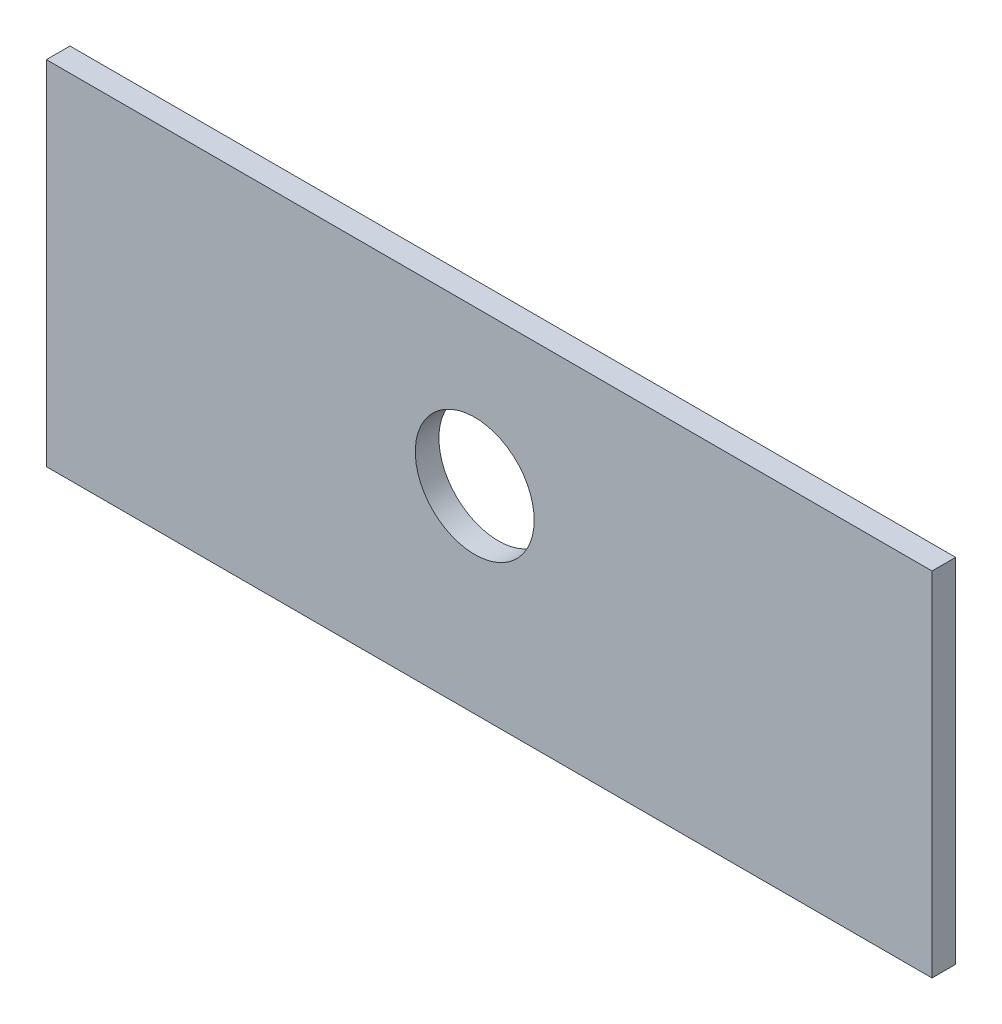
ISO-10303-21;
HEADER;
FILE_DESCRIPTION(('STEP AP214'),'2;1');
FILE_NAME('part.step','',(''),(''),'','','');
FILE_SCHEMA(('AUTOMOTIVE_DESIGN { 1 0 10303 214 1 1 1 1 }'));
ENDSEC;
DATA;
#1=APPLICATION_CONTEXT('core data for automotive mechanical design processes');
#2=APPLICATION_PROTOCOL_DEFINITION('international standard','automotive_design',2000,#1);
#3=PRODUCT_CONTEXT('',#1,'mechanical');
#4=PRODUCT('Part','Part','',(#3));
#5=PRODUCT_RELATED_PRODUCT_CATEGORY('part','',(#4));
#6=PRODUCT_DEFINITION_FORMATION('','',#4);
#7=PRODUCT_DEFINITION_CONTEXT('part definition',#1,'design');
#8=PRODUCT_DEFINITION('design','',#6,#7);
#9=PRODUCT_DEFINITION_SHAPE('','',#8);
#10=(LENGTH_UNIT() NAMED_UNIT(*) SI_UNIT(.MILLI.,.METRE.));
#11=(NAMED_UNIT(*) PLANE_ANGLE_UNIT() SI_UNIT($,.RADIAN.));
#12=(NAMED_UNIT(*) SI_UNIT($,.STERADIAN.) SOLID_ANGLE_UNIT());
#13=UNCERTAINTY_MEASURE_WITH_UNIT(LENGTH_MEASURE(1.E-05),#10,'distance_accuracy_value','');
#14=(GEOMETRIC_REPRESENTATION_CONTEXT(3) GLOBAL_UNCERTAINTY_ASSIGNED_CONTEXT((#13)) GLOBAL_UNIT_ASSIGNED_CONTEXT((#10,
#11,#12)) REPRESENTATION_CONTEXT('',''));
#15=CARTESIAN_POINT('',(0.,0.,0.));
#16=DIRECTION('',(0.,0.,1.));
#17=DIRECTION('',(1.,0.,0.));
#18=AXIS2_PLACEMENT_3D('',#15,#16,#17);
#19=CARTESIAN_POINT('',(0.,0.,2.));
#20=DIRECTION('',(0.,0.,-1.));
#21=DIRECTION('',(-1.,0.,0.));
#22=AXIS2_PLACEMENT_3D('',#19,#20,#21);
#23=PLANE('',#22);
#24=DIRECTION('',(0.,1.,0.));
#25=VECTOR('',#24,1.);
#26=CARTESIAN_POINT('',(29.7412948135718,37.3909558610609,2.));
#27=LINE('',#26,#25);
#28=CARTESIAN_POINT('',(29.7412948135718,7.54055576503256,2.));
#29=VERTEX_POINT('',#28);
#30=CARTESIAN_POINT('',(29.7412948135718,37.3909558610609,2.));
#31=VERTEX_POINT('',#30);
#32=EDGE_CURVE('E93',#29,#31,#27,.T.);
#33=ORIENTED_EDGE('',*,*,#32,.T.);
#34=DIRECTION('',(-0.999999999999904,4.38427673240126E-07,0.));
#35=VECTOR('',#34,1.);
#36=CARTESIAN_POINT('',(-45.2587051864282,37.3909887431364,2.));
#37=LINE('',#36,#35);
#38=CARTESIAN_POINT('',(-45.2587051864282,37.3909887431364,2.));
#39=VERTEX_POINT('',#38);
#40=EDGE_CURVE('E88',#31,#39,#37,.T.);
#41=ORIENTED_EDGE('',*,*,#40,.T.);
#42=DIRECTION('',(0.,-1.,0.));
#43=VECTOR('',#42,1.);
#44=CARTESIAN_POINT('',(-45.2587051864282,7.54055576503256,2.));
#45=LINE('',#44,#43);
#46=CARTESIAN_POINT('',(-45.2587051864282,7.54055576503256,2.));
#47=VERTEX_POINT('',#46);
#48=EDGE_CURVE('E91',#39,#47,#45,.T.);
#49=ORIENTED_EDGE('',*,*,#48,.T.);
#50=DIRECTION('',(1.,0.,0.));
#51=VECTOR('',#50,1.);
#52=CARTESIAN_POINT('',(29.7412948135718,7.54055576503256,2.));
#53=LINE('',#52,#51);
#54=EDGE_CURVE('E58',#47,#29,#53,.T.);
#55=ORIENTED_EDGE('',*,*,#54,.T.);
#56=EDGE_LOOP('',(#33,#41,#49,#55));
#57=FACE_BOUND('',#56,.T.);
#58=CARTESIAN_POINT('',(-8.98326266985911,24.2668672380521,2.));
#59=DIRECTION('',(0.,0.,1.));
#60=DIRECTION('',(1.,0.,0.));
#61=AXIS2_PLACEMENT_3D('',#58,#59,#60);
#62=CIRCLE('',#61,5.03468739175692);
#63=CARTESIAN_POINT('',(-3.94857527810219,24.2668672380521,2.));
#64=VERTEX_POINT('',#63);
#65=EDGE_CURVE('E108',#64,#64,#62,.T.);
#66=ORIENTED_EDGE('',*,*,#65,.F.);
#67=EDGE_LOOP('',(#66));
#68=FACE_BOUND('',#67,.T.);
#69=ADVANCED_FACE('F41',(#57,#68),#23,.F.);
#70=CARTESIAN_POINT('',(0.,0.,0.));
#71=DIRECTION('',(0.,0.,-1.));
#72=DIRECTION('',(-1.,0.,0.));
#73=AXIS2_PLACEMENT_3D('',#70,#71,#72);
#74=PLANE('',#73);
#75=DIRECTION('',(0.,1.,0.));
#76=VECTOR('',#75,1.);
#77=CARTESIAN_POINT('',(29.7412948135718,37.3909558610609,0.));
#78=LINE('',#77,#76);
#79=CARTESIAN_POINT('',(29.7412948135718,7.54055576503256,0.));
#80=VERTEX_POINT('',#79);
#81=CARTESIAN_POINT('',(29.7412948135718,37.3909558610609,0.));
#82=VERTEX_POINT('',#81);
#83=EDGE_CURVE('E105',#80,#82,#78,.T.);
#84=ORIENTED_EDGE('',*,*,#83,.F.);
#85=DIRECTION('',(1.,0.,0.));
#86=VECTOR('',#85,1.);
#87=CARTESIAN_POINT('',(29.7412948135718,7.54055576503256,0.));
#88=LINE('',#87,#86);
#89=CARTESIAN_POINT('',(-45.2587051864282,7.54055576503256,0.));
#90=VERTEX_POINT('',#89);
#91=EDGE_CURVE('E81',#90,#80,#88,.T.);
#92=ORIENTED_EDGE('',*,*,#91,.F.);
#93=DIRECTION('',(0.,-1.,0.));
#94=VECTOR('',#93,1.);
#95=CARTESIAN_POINT('',(-45.2587051864282,7.54055576503256,0.));
#96=LINE('',#95,#94);
#97=CARTESIAN_POINT('',(-45.2587051864282,37.3909887431364,0.));
#98=VERTEX_POINT('',#97);
#99=EDGE_CURVE('E75',#98,#90,#96,.T.);
#100=ORIENTED_EDGE('',*,*,#99,.F.);
#101=DIRECTION('',(-0.999999999999904,4.38427673240126E-07,0.));
#102=VECTOR('',#101,1.);
#103=CARTESIAN_POINT('',(-45.2587051864282,37.3909887431364,0.));
#104=LINE('',#103,#102);
#105=EDGE_CURVE('E97',#82,#98,#104,.T.);
#106=ORIENTED_EDGE('',*,*,#105,.F.);
#107=EDGE_LOOP('',(#84,#92,#100,#106));
#108=FACE_BOUND('',#107,.T.);
#109=CARTESIAN_POINT('',(-8.98326266985911,24.2668672380521,0.));
#110=DIRECTION('',(0.,0.,1.));
#111=DIRECTION('',(1.,0.,0.));
#112=AXIS2_PLACEMENT_3D('',#109,#110,#111);
#113=CIRCLE('',#112,5.03468739175692);
#114=CARTESIAN_POINT('',(-3.94857527810219,24.2668672380521,0.));
#115=VERTEX_POINT('',#114);
#116=EDGE_CURVE('E120',#115,#115,#113,.T.);
#117=ORIENTED_EDGE('',*,*,#116,.T.);
#118=EDGE_LOOP('',(#117));
#119=FACE_BOUND('',#118,.T.);
#120=ADVANCED_FACE('F116',(#108,#119),#74,.T.);
#121=CARTESIAN_POINT('',(29.7412948135718,37.3909558610609,2.));
#122=DIRECTION('',(-1.,0.,0.));
#123=DIRECTION('',(0.,0.,1.));
#124=AXIS2_PLACEMENT_3D('',#121,#122,#123);
#125=PLANE('',#124);
#126=ORIENTED_EDGE('',*,*,#83,.T.);
#127=DIRECTION('',(0.,0.,-1.));
#128=VECTOR('',#127,1.);
#129=CARTESIAN_POINT('',(29.7412948135718,37.3909558610609,2.));
#130=LINE('',#129,#128);
#131=EDGE_CURVE('E11',#31,#82,#130,.T.);
#132=ORIENTED_EDGE('',*,*,#131,.F.);
#133=ORIENTED_EDGE('',*,*,#32,.F.);
#134=DIRECTION('',(0.,0.,-1.));
#135=VECTOR('',#134,1.);
#136=CARTESIAN_POINT('',(29.7412948135718,7.54055576503256,2.));
#137=LINE('',#136,#135);
#138=EDGE_CURVE('E101',#29,#80,#137,.T.);
#139=ORIENTED_EDGE('',*,*,#138,.T.);
#140=EDGE_LOOP('',(#126,#132,#133,#139));
#141=FACE_BOUND('',#140,.T.);
#142=ADVANCED_FACE('F43',(#141),#125,.F.);
#143=CARTESIAN_POINT('',(-45.2587051864282,37.3909887431364,2.));
#144=DIRECTION('',(-4.38427673240126E-07,-0.999999999999904,0.));
#145=DIRECTION('',(0.999999999999904,-4.38427673240126E-07,0.));
#146=AXIS2_PLACEMENT_3D('',#143,#144,#145);
#147=PLANE('',#146);
#148=ORIENTED_EDGE('',*,*,#105,.T.);
#149=DIRECTION('',(0.,0.,-1.));
#150=VECTOR('',#149,1.);
#151=CARTESIAN_POINT('',(-45.2587051864282,37.3909887431364,2.));
#152=LINE('',#151,#150);
#153=EDGE_CURVE('E50',#39,#98,#152,.T.);
#154=ORIENTED_EDGE('',*,*,#153,.F.);
#155=ORIENTED_EDGE('',*,*,#40,.F.);
#156=ORIENTED_EDGE('',*,*,#131,.T.);
#157=EDGE_LOOP('',(#148,#154,#155,#156));
#158=FACE_BOUND('',#157,.T.);
#159=ADVANCED_FACE('F96',(#158),#147,.F.);
#160=CARTESIAN_POINT('',(-45.2587051864282,7.54055576503256,2.));
#161=DIRECTION('',(1.,0.,0.));
#162=DIRECTION('',(0.,0.,-1.));
#163=AXIS2_PLACEMENT_3D('',#160,#161,#162);
#164=PLANE('',#163);
#165=ORIENTED_EDGE('',*,*,#99,.T.);
#166=DIRECTION('',(0.,0.,-1.));
#167=VECTOR('',#166,1.);
#168=CARTESIAN_POINT('',(-45.2587051864282,7.54055576503256,2.));
#169=LINE('',#168,#167);
#170=EDGE_CURVE('E98',#47,#90,#169,.T.);
#171=ORIENTED_EDGE('',*,*,#170,.F.);
#172=ORIENTED_EDGE('',*,*,#48,.F.);
#173=ORIENTED_EDGE('',*,*,#153,.T.);
#174=EDGE_LOOP('',(#165,#171,#172,#173));
#175=FACE_BOUND('',#174,.T.);
#176=ADVANCED_FACE('F99',(#175),#164,.F.);
#177=CARTESIAN_POINT('',(29.7412948135718,7.54055576503256,2.));
#178=DIRECTION('',(0.,1.,0.));
#179=DIRECTION('',(0.,0.,1.));
#180=AXIS2_PLACEMENT_3D('',#177,#178,#179);
#181=PLANE('',#180);
#182=ORIENTED_EDGE('',*,*,#91,.T.);
#183=ORIENTED_EDGE('',*,*,#138,.F.);
#184=ORIENTED_EDGE('',*,*,#54,.F.);
#185=ORIENTED_EDGE('',*,*,#170,.T.);
#186=EDGE_LOOP('',(#182,#183,#184,#185));
#187=FACE_BOUND('',#186,.T.);
#188=ADVANCED_FACE('F113',(#187),#181,.F.);
#189=CARTESIAN_POINT('',(-8.98326266985911,24.2668672380521,2.));
#190=DIRECTION('',(0.,0.,-1.));
#191=DIRECTION('',(-1.,0.,0.));
#192=AXIS2_PLACEMENT_3D('',#189,#190,#191);
#193=CYLINDRICAL_SURFACE('',#192,5.03468739175692);
#194=ORIENTED_EDGE('',*,*,#65,.T.);
#195=EDGE_LOOP('',(#194));
#196=FACE_BOUND('',#195,.T.);
#197=ORIENTED_EDGE('',*,*,#116,.F.);
#198=EDGE_LOOP('',(#197));
#199=FACE_BOUND('',#198,.T.);
#200=ADVANCED_FACE('F126',(#196,#199),#193,.F.);
#201=CLOSED_SHELL('',(#69,#120,#142,#159,#176,#188,#200));
#202=MANIFOLD_SOLID_BREP('B2',#201);
#203=ADVANCED_BREP_SHAPE_REPRESENTATION('',(#18,#202),#14);
#204=SHAPE_DEFINITION_REPRESENTATION(#9,#203);
ENDSEC;
END-ISO-10303-21;
